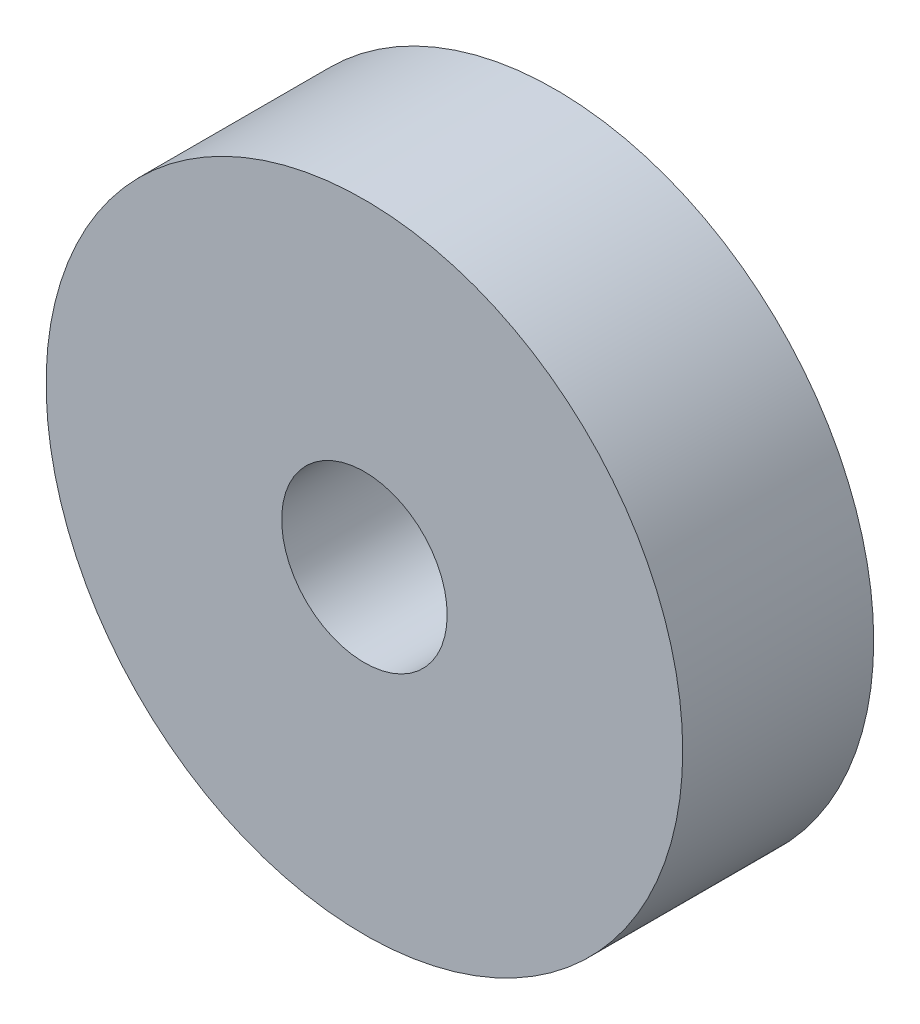
ISO-10303-21;
HEADER;
FILE_DESCRIPTION(('STEP AP214'),'2;1');
FILE_NAME('part.step','',(''),(''),'','','');
FILE_SCHEMA(('AUTOMOTIVE_DESIGN { 1 0 10303 214 1 1 1 1 }'));
ENDSEC;
DATA;
#1=APPLICATION_CONTEXT('core data for automotive mechanical design processes');
#2=APPLICATION_PROTOCOL_DEFINITION('international standard','automotive_design',2000,#1);
#3=PRODUCT_CONTEXT('',#1,'mechanical');
#4=PRODUCT('Part','Part','',(#3));
#5=PRODUCT_RELATED_PRODUCT_CATEGORY('part','',(#4));
#6=PRODUCT_DEFINITION_FORMATION('','',#4);
#7=PRODUCT_DEFINITION_CONTEXT('part definition',#1,'design');
#8=PRODUCT_DEFINITION('design','',#6,#7);
#9=PRODUCT_DEFINITION_SHAPE('','',#8);
#10=(LENGTH_UNIT() NAMED_UNIT(*) SI_UNIT(.MILLI.,.METRE.));
#11=(NAMED_UNIT(*) PLANE_ANGLE_UNIT() SI_UNIT($,.RADIAN.));
#12=(NAMED_UNIT(*) SI_UNIT($,.STERADIAN.) SOLID_ANGLE_UNIT());
#13=UNCERTAINTY_MEASURE_WITH_UNIT(LENGTH_MEASURE(1.E-05),#10,'distance_accuracy_value','');
#14=(GEOMETRIC_REPRESENTATION_CONTEXT(3) GLOBAL_UNCERTAINTY_ASSIGNED_CONTEXT((#13)) GLOBAL_UNIT_ASSIGNED_CONTEXT((#10,
#11,#12)) REPRESENTATION_CONTEXT('',''));
#15=CARTESIAN_POINT('',(0.,0.,0.));
#16=DIRECTION('',(0.,0.,1.));
#17=DIRECTION('',(1.,0.,0.));
#18=AXIS2_PLACEMENT_3D('',#15,#16,#17);
#19=CARTESIAN_POINT('',(0.,0.,6.));
#20=DIRECTION('',(0.,0.,-1.));
#21=DIRECTION('',(-1.,0.,0.));
#22=AXIS2_PLACEMENT_3D('',#19,#20,#21);
#23=CYLINDRICAL_SURFACE('',#22,10.);
#24=CARTESIAN_POINT('',(0.,0.,6.));
#25=DIRECTION('',(0.,0.,1.));
#26=DIRECTION('',(1.,0.,0.));
#27=AXIS2_PLACEMENT_3D('',#24,#25,#26);
#28=CIRCLE('',#27,10.);
#29=CARTESIAN_POINT('',(10.,0.,6.));
#30=VERTEX_POINT('',#29);
#31=EDGE_CURVE('E10',#30,#30,#28,.T.);
#32=ORIENTED_EDGE('',*,*,#31,.F.);
#33=EDGE_LOOP('',(#32));
#34=FACE_BOUND('',#33,.T.);
#35=CARTESIAN_POINT('',(0.,0.,0.));
#36=DIRECTION('',(0.,0.,1.));
#37=DIRECTION('',(1.,0.,0.));
#38=AXIS2_PLACEMENT_3D('',#35,#36,#37);
#39=CIRCLE('',#38,10.);
#40=CARTESIAN_POINT('',(10.,0.,0.));
#41=VERTEX_POINT('',#40);
#42=EDGE_CURVE('E40',#41,#41,#39,.T.);
#43=ORIENTED_EDGE('',*,*,#42,.T.);
#44=EDGE_LOOP('',(#43));
#45=FACE_BOUND('',#44,.T.);
#46=ADVANCED_FACE('F37',(#34,#45),#23,.T.);
#47=CARTESIAN_POINT('',(0.,0.,6.));
#48=DIRECTION('',(0.,0.,1.));
#49=DIRECTION('',(1.,0.,0.));
#50=AXIS2_PLACEMENT_3D('',#47,#48,#49);
#51=PLANE('',#50);
#52=CARTESIAN_POINT('',(0.,0.,6.));
#53=DIRECTION('',(0.,0.,1.));
#54=DIRECTION('',(1.,0.,0.));
#55=AXIS2_PLACEMENT_3D('',#52,#53,#54);
#56=CIRCLE('',#55,2.6);
#57=CARTESIAN_POINT('',(2.6,0.,6.));
#58=VERTEX_POINT('',#57);
#59=EDGE_CURVE('E49',#58,#58,#56,.T.);
#60=ORIENTED_EDGE('',*,*,#59,.F.);
#61=EDGE_LOOP('',(#60));
#62=FACE_BOUND('',#61,.T.);
#63=ORIENTED_EDGE('',*,*,#31,.T.);
#64=EDGE_LOOP('',(#63));
#65=FACE_BOUND('',#64,.T.);
#66=ADVANCED_FACE('F64',(#62,#65),#51,.T.);
#67=CARTESIAN_POINT('',(0.,0.,0.));
#68=DIRECTION('',(0.,0.,1.));
#69=DIRECTION('',(1.,0.,0.));
#70=AXIS2_PLACEMENT_3D('',#67,#68,#69);
#71=PLANE('',#70);
#72=ORIENTED_EDGE('',*,*,#42,.F.);
#73=EDGE_LOOP('',(#72));
#74=FACE_BOUND('',#73,.T.);
#75=ADVANCED_FACE('F60',(#74),#71,.F.);
#76=CARTESIAN_POINT('',(0.,0.,1.8));
#77=DIRECTION('',(0.,0.,1.));
#78=DIRECTION('',(1.,0.,0.));
#79=AXIS2_PLACEMENT_3D('',#76,#77,#78);
#80=CYLINDRICAL_SURFACE('',#79,2.6);
#81=CARTESIAN_POINT('',(0.,0.,1.8));
#82=DIRECTION('',(0.,0.,1.));
#83=DIRECTION('',(1.,0.,0.));
#84=AXIS2_PLACEMENT_3D('',#81,#82,#83);
#85=CIRCLE('',#84,2.6);
#86=CARTESIAN_POINT('',(2.6,0.,1.8));
#87=VERTEX_POINT('',#86);
#88=EDGE_CURVE('E47',#87,#87,#85,.T.);
#89=ORIENTED_EDGE('',*,*,#88,.F.);
#90=EDGE_LOOP('',(#89));
#91=FACE_BOUND('',#90,.T.);
#92=ORIENTED_EDGE('',*,*,#59,.T.);
#93=EDGE_LOOP('',(#92));
#94=FACE_BOUND('',#93,.T.);
#95=ADVANCED_FACE('F57',(#91,#94),#80,.F.);
#96=CARTESIAN_POINT('',(0.,0.,1.8));
#97=DIRECTION('',(0.,0.,1.));
#98=DIRECTION('',(1.,0.,0.));
#99=AXIS2_PLACEMENT_3D('',#96,#97,#98);
#100=PLANE('',#99);
#101=ORIENTED_EDGE('',*,*,#88,.T.);
#102=EDGE_LOOP('',(#101));
#103=FACE_BOUND('',#102,.T.);
#104=ADVANCED_FACE('F55',(#103),#100,.T.);
#105=CLOSED_SHELL('',(#46,#66,#75,#95,#104));
#106=MANIFOLD_SOLID_BREP('B2',#105);
#107=ADVANCED_BREP_SHAPE_REPRESENTATION('',(#18,#106),#14);
#108=SHAPE_DEFINITION_REPRESENTATION(#9,#107);
ENDSEC;
END-ISO-10303-21;
